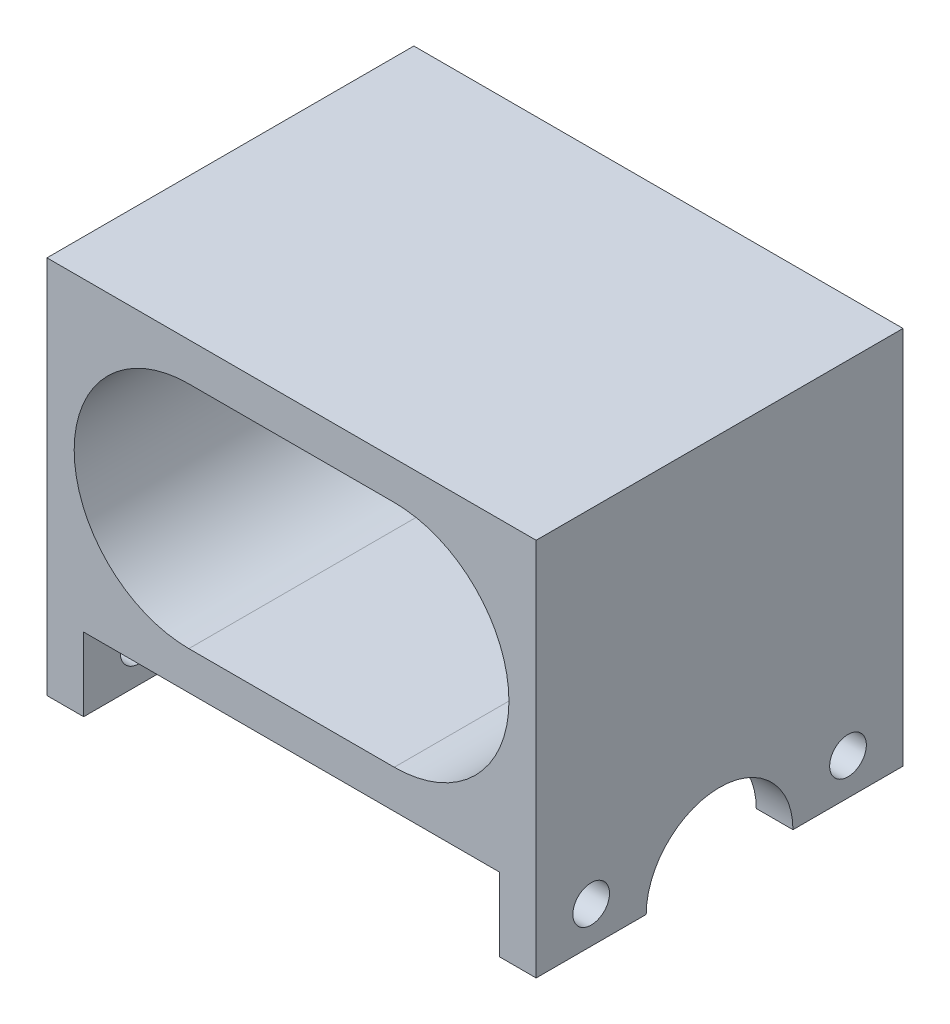
ISO-10303-21;
HEADER;
FILE_DESCRIPTION(('STEP AP214'),'2;1');
FILE_NAME('part.step','',(''),(''),'','','');
FILE_SCHEMA(('AUTOMOTIVE_DESIGN { 1 0 10303 214 1 1 1 1 }'));
ENDSEC;
DATA;
#1=APPLICATION_CONTEXT('core data for automotive mechanical design processes');
#2=APPLICATION_PROTOCOL_DEFINITION('international standard','automotive_design',2000,#1);
#3=PRODUCT_CONTEXT('',#1,'mechanical');
#4=PRODUCT('Part','Part','',(#3));
#5=PRODUCT_RELATED_PRODUCT_CATEGORY('part','',(#4));
#6=PRODUCT_DEFINITION_FORMATION('','',#4);
#7=PRODUCT_DEFINITION_CONTEXT('part definition',#1,'design');
#8=PRODUCT_DEFINITION('design','',#6,#7);
#9=PRODUCT_DEFINITION_SHAPE('','',#8);
#10=(LENGTH_UNIT() NAMED_UNIT(*) SI_UNIT(.MILLI.,.METRE.));
#11=(NAMED_UNIT(*) PLANE_ANGLE_UNIT() SI_UNIT($,.RADIAN.));
#12=(NAMED_UNIT(*) SI_UNIT($,.STERADIAN.) SOLID_ANGLE_UNIT());
#13=UNCERTAINTY_MEASURE_WITH_UNIT(LENGTH_MEASURE(1.E-05),#10,'distance_accuracy_value','');
#14=(GEOMETRIC_REPRESENTATION_CONTEXT(3) GLOBAL_UNCERTAINTY_ASSIGNED_CONTEXT((#13)) GLOBAL_UNIT_ASSIGNED_CONTEXT((#10,
#11,#12)) REPRESENTATION_CONTEXT('',''));
#15=CARTESIAN_POINT('',(0.,0.,0.));
#16=DIRECTION('',(0.,0.,1.));
#17=DIRECTION('',(1.,0.,0.));
#18=AXIS2_PLACEMENT_3D('',#15,#16,#17);
#19=CARTESIAN_POINT('',(-20.,-12.5,-15.));
#20=DIRECTION('',(0.,-1.,0.));
#21=DIRECTION('',(0.,0.,-1.));
#22=AXIS2_PLACEMENT_3D('',#19,#20,#21);
#23=PLANE('',#22);
#24=DIRECTION('',(0.,0.,1.));
#25=VECTOR('',#24,1.);
#26=CARTESIAN_POINT('',(-17.,-12.5,15.));
#27=LINE('',#26,#25);
#28=CARTESIAN_POINT('',(-17.,-12.5,0.));
#29=VERTEX_POINT('',#28);
#30=CARTESIAN_POINT('',(-17.,-12.5,15.));
#31=VERTEX_POINT('',#30);
#32=EDGE_CURVE('E172',#29,#31,#27,.T.);
#33=ORIENTED_EDGE('',*,*,#32,.F.);
#34=DIRECTION('',(0.,0.,-1.));
#35=VECTOR('',#34,1.);
#36=CARTESIAN_POINT('',(-17.,-12.5,-15.));
#37=LINE('',#36,#35);
#38=CARTESIAN_POINT('',(-17.,-12.5,-15.));
#39=VERTEX_POINT('',#38);
#40=EDGE_CURVE('E303',#29,#39,#37,.T.);
#41=ORIENTED_EDGE('',*,*,#40,.T.);
#42=DIRECTION('',(1.,0.,0.));
#43=VECTOR('',#42,1.);
#44=CARTESIAN_POINT('',(-20.,-12.5,-15.));
#45=LINE('',#44,#43);
#46=CARTESIAN_POINT('',(17.,-12.5,-15.));
#47=VERTEX_POINT('',#46);
#48=EDGE_CURVE('E288',#39,#47,#45,.T.);
#49=ORIENTED_EDGE('',*,*,#48,.T.);
#50=DIRECTION('',(0.,0.,-1.));
#51=VECTOR('',#50,1.);
#52=CARTESIAN_POINT('',(17.,-12.5,-15.));
#53=LINE('',#52,#51);
#54=CARTESIAN_POINT('',(17.,-12.5,0.));
#55=VERTEX_POINT('',#54);
#56=EDGE_CURVE('E331',#55,#47,#53,.T.);
#57=ORIENTED_EDGE('',*,*,#56,.F.);
#58=DIRECTION('',(0.,0.,1.));
#59=VECTOR('',#58,1.);
#60=CARTESIAN_POINT('',(17.,-12.5,15.));
#61=LINE('',#60,#59);
#62=CARTESIAN_POINT('',(17.,-12.5,15.));
#63=VERTEX_POINT('',#62);
#64=EDGE_CURVE('E220',#55,#63,#61,.T.);
#65=ORIENTED_EDGE('',*,*,#64,.T.);
#66=DIRECTION('',(1.,0.,0.));
#67=VECTOR('',#66,1.);
#68=CARTESIAN_POINT('',(-20.,-12.5,15.));
#69=LINE('',#68,#67);
#70=EDGE_CURVE('E258',#31,#63,#69,.T.);
#71=ORIENTED_EDGE('',*,*,#70,.F.);
#72=EDGE_LOOP('',(#33,#41,#49,#57,#65,#71));
#73=FACE_BOUND('',#72,.T.);
#74=ADVANCED_FACE('F33',(#73),#23,.T.);
#75=CARTESIAN_POINT('',(20.,-12.5,-15.));
#76=DIRECTION('',(1.,0.,0.));
#77=DIRECTION('',(0.,0.,-1.));
#78=AXIS2_PLACEMENT_3D('',#75,#76,#77);
#79=PLANE('',#78);
#80=DIRECTION('',(0.,0.,1.));
#81=VECTOR('',#80,1.);
#82=CARTESIAN_POINT('',(20.,12.5,-15.));
#83=LINE('',#82,#81);
#84=CARTESIAN_POINT('',(20.,12.5,-15.));
#85=VERTEX_POINT('',#84);
#86=CARTESIAN_POINT('',(20.,12.5,15.));
#87=VERTEX_POINT('',#86);
#88=EDGE_CURVE('E290',#85,#87,#83,.T.);
#89=ORIENTED_EDGE('',*,*,#88,.T.);
#90=DIRECTION('',(0.,1.,0.));
#91=VECTOR('',#90,1.);
#92=CARTESIAN_POINT('',(20.,-12.5,15.));
#93=LINE('',#92,#91);
#94=CARTESIAN_POINT('',(20.,-18.5,15.));
#95=VERTEX_POINT('',#94);
#96=EDGE_CURVE('E250',#95,#87,#93,.T.);
#97=ORIENTED_EDGE('',*,*,#96,.F.);
#98=DIRECTION('',(0.,0.,-1.));
#99=VECTOR('',#98,1.);
#100=CARTESIAN_POINT('',(20.,-18.5,15.));
#101=LINE('',#100,#99);
#102=CARTESIAN_POINT('',(20.,-18.5,6.));
#103=VERTEX_POINT('',#102);
#104=EDGE_CURVE('E230',#95,#103,#101,.T.);
#105=ORIENTED_EDGE('',*,*,#104,.T.);
#106=CARTESIAN_POINT('',(20.,-18.5,0.));
#107=DIRECTION('',(1.,0.,0.));
#108=DIRECTION('',(0.,0.,-1.));
#109=AXIS2_PLACEMENT_3D('',#106,#107,#108);
#110=CIRCLE('',#109,6.);
#111=CARTESIAN_POINT('',(20.,-12.5,0.));
#112=VERTEX_POINT('',#111);
#113=EDGE_CURVE('E42',#103,#112,#110,.F.);
#114=ORIENTED_EDGE('',*,*,#113,.T.);
#115=CARTESIAN_POINT('',(20.,-18.5,0.));
#116=DIRECTION('',(1.,0.,0.));
#117=DIRECTION('',(0.,0.,-1.));
#118=AXIS2_PLACEMENT_3D('',#115,#116,#117);
#119=CIRCLE('',#118,6.);
#120=CARTESIAN_POINT('',(20.,-18.5,-6.));
#121=VERTEX_POINT('',#120);
#122=EDGE_CURVE('E186',#112,#121,#119,.F.);
#123=ORIENTED_EDGE('',*,*,#122,.T.);
#124=DIRECTION('',(0.,0.,1.));
#125=VECTOR('',#124,1.);
#126=CARTESIAN_POINT('',(20.,-18.5,-15.));
#127=LINE('',#126,#125);
#128=CARTESIAN_POINT('',(20.,-18.5,-15.));
#129=VERTEX_POINT('',#128);
#130=EDGE_CURVE('E326',#129,#121,#127,.T.);
#131=ORIENTED_EDGE('',*,*,#130,.F.);
#132=DIRECTION('',(0.,1.,0.));
#133=VECTOR('',#132,1.);
#134=CARTESIAN_POINT('',(20.,-12.5,-15.));
#135=LINE('',#134,#133);
#136=EDGE_CURVE('E275',#129,#85,#135,.T.);
#137=ORIENTED_EDGE('',*,*,#136,.T.);
#138=EDGE_LOOP('',(#89,#97,#105,#114,#123,#131,#137));
#139=FACE_BOUND('',#138,.T.);
#140=CARTESIAN_POINT('',(20.,-15.5,10.5));
#141=DIRECTION('',(1.,0.,0.));
#142=DIRECTION('',(0.,0.,-1.));
#143=AXIS2_PLACEMENT_3D('',#140,#141,#142);
#144=CIRCLE('',#143,1.5);
#145=CARTESIAN_POINT('',(20.,-15.5,9.));
#146=VERTEX_POINT('',#145);
#147=EDGE_CURVE('E342',#146,#146,#144,.T.);
#148=ORIENTED_EDGE('',*,*,#147,.F.);
#149=EDGE_LOOP('',(#148));
#150=FACE_BOUND('',#149,.T.);
#151=CARTESIAN_POINT('',(20.,-15.5,-10.5));
#152=DIRECTION('',(-1.,0.,0.));
#153=DIRECTION('',(0.,0.,1.));
#154=AXIS2_PLACEMENT_3D('',#151,#152,#153);
#155=CIRCLE('',#154,1.5);
#156=CARTESIAN_POINT('',(20.,-15.5,-9.));
#157=VERTEX_POINT('',#156);
#158=EDGE_CURVE('E315',#157,#157,#155,.T.);
#159=ORIENTED_EDGE('',*,*,#158,.T.);
#160=EDGE_LOOP('',(#159));
#161=FACE_BOUND('',#160,.T.);
#162=ADVANCED_FACE('F350',(#139,#150,#161),#79,.T.);
#163=CARTESIAN_POINT('',(-20.,-12.5,-15.));
#164=DIRECTION('',(-1.,0.,0.));
#165=DIRECTION('',(0.,0.,1.));
#166=AXIS2_PLACEMENT_3D('',#163,#164,#165);
#167=PLANE('',#166);
#168=DIRECTION('',(0.,-1.,0.));
#169=VECTOR('',#168,1.);
#170=CARTESIAN_POINT('',(-20.,-12.5,-15.));
#171=LINE('',#170,#169);
#172=CARTESIAN_POINT('',(-20.,12.5,-15.));
#173=VERTEX_POINT('',#172);
#174=CARTESIAN_POINT('',(-20.,-18.5,-15.));
#175=VERTEX_POINT('',#174);
#176=EDGE_CURVE('E286',#173,#175,#171,.T.);
#177=ORIENTED_EDGE('',*,*,#176,.T.);
#178=DIRECTION('',(0.,0.,1.));
#179=VECTOR('',#178,1.);
#180=CARTESIAN_POINT('',(-20.,-18.5,-15.));
#181=LINE('',#180,#179);
#182=CARTESIAN_POINT('',(-20.,-18.5,-6.));
#183=VERTEX_POINT('',#182);
#184=EDGE_CURVE('E322',#175,#183,#181,.T.);
#185=ORIENTED_EDGE('',*,*,#184,.T.);
#186=CARTESIAN_POINT('',(-20.,-18.5,0.));
#187=DIRECTION('',(-1.,0.,0.));
#188=DIRECTION('',(0.,0.,1.));
#189=AXIS2_PLACEMENT_3D('',#186,#187,#188);
#190=CIRCLE('',#189,6.);
#191=CARTESIAN_POINT('',(-20.,-12.5,0.));
#192=VERTEX_POINT('',#191);
#193=EDGE_CURVE('E57',#183,#192,#190,.F.);
#194=ORIENTED_EDGE('',*,*,#193,.T.);
#195=CARTESIAN_POINT('',(-20.,-18.5,0.));
#196=DIRECTION('',(-1.,0.,0.));
#197=DIRECTION('',(0.,0.,1.));
#198=AXIS2_PLACEMENT_3D('',#195,#196,#197);
#199=CIRCLE('',#198,6.);
#200=CARTESIAN_POINT('',(-20.,-18.5,6.));
#201=VERTEX_POINT('',#200);
#202=EDGE_CURVE('E187',#192,#201,#199,.F.);
#203=ORIENTED_EDGE('',*,*,#202,.T.);
#204=DIRECTION('',(0.,0.,-1.));
#205=VECTOR('',#204,1.);
#206=CARTESIAN_POINT('',(-20.,-18.5,15.));
#207=LINE('',#206,#205);
#208=CARTESIAN_POINT('',(-20.,-18.5,15.));
#209=VERTEX_POINT('',#208);
#210=EDGE_CURVE('E178',#209,#201,#207,.T.);
#211=ORIENTED_EDGE('',*,*,#210,.F.);
#212=DIRECTION('',(0.,-1.,0.));
#213=VECTOR('',#212,1.);
#214=CARTESIAN_POINT('',(-20.,-12.5,15.));
#215=LINE('',#214,#213);
#216=CARTESIAN_POINT('',(-20.,12.5,15.));
#217=VERTEX_POINT('',#216);
#218=EDGE_CURVE('E256',#217,#209,#215,.T.);
#219=ORIENTED_EDGE('',*,*,#218,.F.);
#220=DIRECTION('',(0.,0.,1.));
#221=VECTOR('',#220,1.);
#222=CARTESIAN_POINT('',(-20.,12.5,-15.));
#223=LINE('',#222,#221);
#224=EDGE_CURVE('E291',#173,#217,#223,.T.);
#225=ORIENTED_EDGE('',*,*,#224,.F.);
#226=EDGE_LOOP('',(#177,#185,#194,#203,#211,#219,#225));
#227=FACE_BOUND('',#226,.T.);
#228=CARTESIAN_POINT('',(-20.,-15.5,-10.5));
#229=DIRECTION('',(-1.,0.,0.));
#230=DIRECTION('',(0.,0.,1.));
#231=AXIS2_PLACEMENT_3D('',#228,#229,#230);
#232=CIRCLE('',#231,1.5);
#233=CARTESIAN_POINT('',(-20.,-15.5,-9.));
#234=VERTEX_POINT('',#233);
#235=EDGE_CURVE('E615',#234,#234,#232,.T.);
#236=ORIENTED_EDGE('',*,*,#235,.F.);
#237=EDGE_LOOP('',(#236));
#238=FACE_BOUND('',#237,.T.);
#239=CARTESIAN_POINT('',(-20.,-15.5,10.5));
#240=DIRECTION('',(1.,0.,0.));
#241=DIRECTION('',(0.,0.,-1.));
#242=AXIS2_PLACEMENT_3D('',#239,#240,#241);
#243=CIRCLE('',#242,1.5);
#244=CARTESIAN_POINT('',(-20.,-15.5,9.));
#245=VERTEX_POINT('',#244);
#246=EDGE_CURVE('E197',#245,#245,#243,.T.);
#247=ORIENTED_EDGE('',*,*,#246,.T.);
#248=EDGE_LOOP('',(#247));
#249=FACE_BOUND('',#248,.T.);
#250=ADVANCED_FACE('F353',(#227,#238,#249),#167,.T.);
#251=CARTESIAN_POINT('',(-20.,12.5,-15.));
#252=DIRECTION('',(0.,1.,0.));
#253=DIRECTION('',(-1.,0.,0.));
#254=AXIS2_PLACEMENT_3D('',#251,#252,#253);
#255=PLANE('',#254);
#256=ORIENTED_EDGE('',*,*,#224,.T.);
#257=DIRECTION('',(-1.,0.,0.));
#258=VECTOR('',#257,1.);
#259=CARTESIAN_POINT('',(-20.,12.5,15.));
#260=LINE('',#259,#258);
#261=EDGE_CURVE('E253',#87,#217,#260,.T.);
#262=ORIENTED_EDGE('',*,*,#261,.F.);
#263=ORIENTED_EDGE('',*,*,#88,.F.);
#264=DIRECTION('',(-1.,0.,0.));
#265=VECTOR('',#264,1.);
#266=CARTESIAN_POINT('',(-20.,12.5,-15.));
#267=LINE('',#266,#265);
#268=EDGE_CURVE('E283',#85,#173,#267,.T.);
#269=ORIENTED_EDGE('',*,*,#268,.T.);
#270=EDGE_LOOP('',(#256,#262,#263,#269));
#271=FACE_BOUND('',#270,.T.);
#272=ADVANCED_FACE('F382',(#271),#255,.T.);
#273=CARTESIAN_POINT('',(0.,0.,-15.));
#274=DIRECTION('',(0.,0.,-1.));
#275=DIRECTION('',(-1.,0.,0.));
#276=AXIS2_PLACEMENT_3D('',#273,#274,#275);
#277=PLANE('',#276);
#278=CARTESIAN_POINT('',(-8.4,0.,-15.));
#279=DIRECTION('',(0.,0.,1.));
#280=DIRECTION('',(1.,0.,0.));
#281=AXIS2_PLACEMENT_3D('',#278,#279,#280);
#282=CIRCLE('',#281,9.375);
#283=CARTESIAN_POINT('',(-8.4,9.37500000000001,-15.));
#284=VERTEX_POINT('',#283);
#285=CARTESIAN_POINT('',(-8.4,-9.375,-15.));
#286=VERTEX_POINT('',#285);
#287=EDGE_CURVE('E260',#284,#286,#282,.T.);
#288=ORIENTED_EDGE('',*,*,#287,.T.);
#289=DIRECTION('',(1.,0.,0.));
#290=VECTOR('',#289,1.);
#291=CARTESIAN_POINT('',(-8.4,-9.375,-15.));
#292=LINE('',#291,#290);
#293=CARTESIAN_POINT('',(8.39999999999999,-9.375,-15.));
#294=VERTEX_POINT('',#293);
#295=EDGE_CURVE('E263',#286,#294,#292,.T.);
#296=ORIENTED_EDGE('',*,*,#295,.T.);
#297=CARTESIAN_POINT('',(8.39999999999999,0.,-15.));
#298=DIRECTION('',(0.,0.,1.));
#299=DIRECTION('',(1.,0.,0.));
#300=AXIS2_PLACEMENT_3D('',#297,#298,#299);
#301=CIRCLE('',#300,9.375);
#302=CARTESIAN_POINT('',(8.39999999999999,9.37500000000001,-15.));
#303=VERTEX_POINT('',#302);
#304=EDGE_CURVE('E266',#294,#303,#301,.T.);
#305=ORIENTED_EDGE('',*,*,#304,.T.);
#306=DIRECTION('',(-1.,0.,0.));
#307=VECTOR('',#306,1.);
#308=CARTESIAN_POINT('',(-8.4,9.37500000000001,-15.));
#309=LINE('',#308,#307);
#310=EDGE_CURVE('E269',#303,#284,#309,.T.);
#311=ORIENTED_EDGE('',*,*,#310,.T.);
#312=EDGE_LOOP('',(#288,#296,#305,#311));
#313=FACE_BOUND('',#312,.T.);
#314=ORIENTED_EDGE('',*,*,#136,.F.);
#315=DIRECTION('',(1.,0.,0.));
#316=VECTOR('',#315,1.);
#317=CARTESIAN_POINT('',(17.,-18.5,-15.));
#318=LINE('',#317,#316);
#319=CARTESIAN_POINT('',(17.,-18.5,-15.));
#320=VERTEX_POINT('',#319);
#321=EDGE_CURVE('E339',#320,#129,#318,.T.);
#322=ORIENTED_EDGE('',*,*,#321,.F.);
#323=DIRECTION('',(0.,-1.,0.));
#324=VECTOR('',#323,1.);
#325=CARTESIAN_POINT('',(17.,-12.5,-15.));
#326=LINE('',#325,#324);
#327=EDGE_CURVE('E328',#47,#320,#326,.T.);
#328=ORIENTED_EDGE('',*,*,#327,.F.);
#329=ORIENTED_EDGE('',*,*,#48,.F.);
#330=DIRECTION('',(0.,-1.,0.));
#331=VECTOR('',#330,1.);
#332=CARTESIAN_POINT('',(-17.,-12.5,-15.));
#333=LINE('',#332,#331);
#334=CARTESIAN_POINT('',(-17.,-18.5,-15.));
#335=VERTEX_POINT('',#334);
#336=EDGE_CURVE('E312',#39,#335,#333,.T.);
#337=ORIENTED_EDGE('',*,*,#336,.T.);
#338=DIRECTION('',(-1.,0.,0.));
#339=VECTOR('',#338,1.);
#340=CARTESIAN_POINT('',(-17.,-18.5,-15.));
#341=LINE('',#340,#339);
#342=EDGE_CURVE('E311',#335,#175,#341,.T.);
#343=ORIENTED_EDGE('',*,*,#342,.T.);
#344=ORIENTED_EDGE('',*,*,#176,.F.);
#345=ORIENTED_EDGE('',*,*,#268,.F.);
#346=EDGE_LOOP('',(#314,#322,#328,#329,#337,#343,#344,#345));
#347=FACE_BOUND('',#346,.T.);
#348=ADVANCED_FACE('F378',(#313,#347),#277,.T.);
#349=CARTESIAN_POINT('',(-8.4,0.,-15.));
#350=DIRECTION('',(0.,0.,1.));
#351=DIRECTION('',(1.,0.,0.));
#352=AXIS2_PLACEMENT_3D('',#349,#350,#351);
#353=CYLINDRICAL_SURFACE('',#352,9.375);
#354=DIRECTION('',(0.,0.,1.));
#355=VECTOR('',#354,1.);
#356=CARTESIAN_POINT('',(-8.4,9.37500000000001,-15.));
#357=LINE('',#356,#355);
#358=CARTESIAN_POINT('',(-8.4,9.37500000000001,15.));
#359=VERTEX_POINT('',#358);
#360=EDGE_CURVE('E273',#284,#359,#357,.T.);
#361=ORIENTED_EDGE('',*,*,#360,.T.);
#362=CARTESIAN_POINT('',(-8.4,0.,15.));
#363=DIRECTION('',(0.,0.,1.));
#364=DIRECTION('',(1.,0.,0.));
#365=AXIS2_PLACEMENT_3D('',#362,#363,#364);
#366=CIRCLE('',#365,9.375);
#367=CARTESIAN_POINT('',(-8.4,-9.375,15.));
#368=VERTEX_POINT('',#367);
#369=EDGE_CURVE('E237',#359,#368,#366,.T.);
#370=ORIENTED_EDGE('',*,*,#369,.T.);
#371=DIRECTION('',(0.,0.,1.));
#372=VECTOR('',#371,1.);
#373=CARTESIAN_POINT('',(-8.4,-9.375,-15.));
#374=LINE('',#373,#372);
#375=EDGE_CURVE('E272',#286,#368,#374,.T.);
#376=ORIENTED_EDGE('',*,*,#375,.F.);
#377=ORIENTED_EDGE('',*,*,#287,.F.);
#378=EDGE_LOOP('',(#361,#370,#376,#377));
#379=FACE_BOUND('',#378,.T.);
#380=ADVANCED_FACE('F526',(#379),#353,.F.);
#381=CARTESIAN_POINT('',(-8.4,9.37500000000001,-15.));
#382=DIRECTION('',(0.,1.,0.));
#383=DIRECTION('',(-1.,0.,0.));
#384=AXIS2_PLACEMENT_3D('',#381,#382,#383);
#385=PLANE('',#384);
#386=DIRECTION('',(0.,0.,1.));
#387=VECTOR('',#386,1.);
#388=CARTESIAN_POINT('',(8.39999999999999,9.37500000000001,-15.));
#389=LINE('',#388,#387);
#390=CARTESIAN_POINT('',(8.39999999999999,9.37500000000001,15.));
#391=VERTEX_POINT('',#390);
#392=EDGE_CURVE('E276',#303,#391,#389,.T.);
#393=ORIENTED_EDGE('',*,*,#392,.T.);
#394=DIRECTION('',(-1.,0.,0.));
#395=VECTOR('',#394,1.);
#396=CARTESIAN_POINT('',(-8.4,9.37500000000001,15.));
#397=LINE('',#396,#395);
#398=EDGE_CURVE('E247',#391,#359,#397,.T.);
#399=ORIENTED_EDGE('',*,*,#398,.T.);
#400=ORIENTED_EDGE('',*,*,#360,.F.);
#401=ORIENTED_EDGE('',*,*,#310,.F.);
#402=EDGE_LOOP('',(#393,#399,#400,#401));
#403=FACE_BOUND('',#402,.T.);
#404=ADVANCED_FACE('F534',(#403),#385,.F.);
#405=CARTESIAN_POINT('',(8.39999999999999,0.,-15.));
#406=DIRECTION('',(0.,0.,1.));
#407=DIRECTION('',(1.,0.,0.));
#408=AXIS2_PLACEMENT_3D('',#405,#406,#407);
#409=CYLINDRICAL_SURFACE('',#408,9.375);
#410=DIRECTION('',(0.,0.,1.));
#411=VECTOR('',#410,1.);
#412=CARTESIAN_POINT('',(8.39999999999999,-9.375,-15.));
#413=LINE('',#412,#411);
#414=CARTESIAN_POINT('',(8.39999999999999,-9.375,15.));
#415=VERTEX_POINT('',#414);
#416=EDGE_CURVE('E278',#294,#415,#413,.T.);
#417=ORIENTED_EDGE('',*,*,#416,.T.);
#418=CARTESIAN_POINT('',(8.39999999999999,0.,15.));
#419=DIRECTION('',(0.,0.,1.));
#420=DIRECTION('',(1.,0.,0.));
#421=AXIS2_PLACEMENT_3D('',#418,#419,#420);
#422=CIRCLE('',#421,9.375);
#423=EDGE_CURVE('E244',#415,#391,#422,.T.);
#424=ORIENTED_EDGE('',*,*,#423,.T.);
#425=ORIENTED_EDGE('',*,*,#392,.F.);
#426=ORIENTED_EDGE('',*,*,#304,.F.);
#427=EDGE_LOOP('',(#417,#424,#425,#426));
#428=FACE_BOUND('',#427,.T.);
#429=ADVANCED_FACE('F542',(#428),#409,.F.);
#430=CARTESIAN_POINT('',(-8.4,-9.375,-15.));
#431=DIRECTION('',(0.,-1.,0.));
#432=DIRECTION('',(1.,0.,0.));
#433=AXIS2_PLACEMENT_3D('',#430,#431,#432);
#434=PLANE('',#433);
#435=ORIENTED_EDGE('',*,*,#375,.T.);
#436=DIRECTION('',(1.,0.,0.));
#437=VECTOR('',#436,1.);
#438=CARTESIAN_POINT('',(-8.4,-9.375,15.));
#439=LINE('',#438,#437);
#440=EDGE_CURVE('E241',#368,#415,#439,.T.);
#441=ORIENTED_EDGE('',*,*,#440,.T.);
#442=ORIENTED_EDGE('',*,*,#416,.F.);
#443=ORIENTED_EDGE('',*,*,#295,.F.);
#444=EDGE_LOOP('',(#435,#441,#442,#443));
#445=FACE_BOUND('',#444,.T.);
#446=ADVANCED_FACE('F551',(#445),#434,.F.);
#447=CARTESIAN_POINT('',(0.,0.,15.));
#448=DIRECTION('',(0.,0.,-1.));
#449=DIRECTION('',(-1.,0.,0.));
#450=AXIS2_PLACEMENT_3D('',#447,#448,#449);
#451=PLANE('',#450);
#452=ORIENTED_EDGE('',*,*,#96,.T.);
#453=ORIENTED_EDGE('',*,*,#261,.T.);
#454=ORIENTED_EDGE('',*,*,#218,.T.);
#455=DIRECTION('',(-1.,0.,0.));
#456=VECTOR('',#455,1.);
#457=CARTESIAN_POINT('',(-17.,-18.5,15.));
#458=LINE('',#457,#456);
#459=CARTESIAN_POINT('',(-17.,-18.5,15.));
#460=VERTEX_POINT('',#459);
#461=EDGE_CURVE('E180',#460,#209,#458,.T.);
#462=ORIENTED_EDGE('',*,*,#461,.F.);
#463=DIRECTION('',(0.,-1.,0.));
#464=VECTOR('',#463,1.);
#465=CARTESIAN_POINT('',(-17.,-12.5,15.));
#466=LINE('',#465,#464);
#467=EDGE_CURVE('E167',#31,#460,#466,.T.);
#468=ORIENTED_EDGE('',*,*,#467,.F.);
#469=ORIENTED_EDGE('',*,*,#70,.T.);
#470=DIRECTION('',(0.,-1.,0.));
#471=VECTOR('',#470,1.);
#472=CARTESIAN_POINT('',(17.,-12.5,15.));
#473=LINE('',#472,#471);
#474=CARTESIAN_POINT('',(17.,-18.5,15.));
#475=VERTEX_POINT('',#474);
#476=EDGE_CURVE('E227',#63,#475,#473,.T.);
#477=ORIENTED_EDGE('',*,*,#476,.T.);
#478=DIRECTION('',(1.,0.,0.));
#479=VECTOR('',#478,1.);
#480=CARTESIAN_POINT('',(17.,-18.5,15.));
#481=LINE('',#480,#479);
#482=EDGE_CURVE('E226',#475,#95,#481,.T.);
#483=ORIENTED_EDGE('',*,*,#482,.T.);
#484=EDGE_LOOP('',(#452,#453,#454,#462,#468,#469,#477,#483));
#485=FACE_BOUND('',#484,.T.);
#486=ORIENTED_EDGE('',*,*,#369,.F.);
#487=ORIENTED_EDGE('',*,*,#398,.F.);
#488=ORIENTED_EDGE('',*,*,#423,.F.);
#489=ORIENTED_EDGE('',*,*,#440,.F.);
#490=EDGE_LOOP('',(#486,#487,#488,#489));
#491=FACE_BOUND('',#490,.T.);
#492=ADVANCED_FACE('F480',(#485,#491),#451,.F.);
#493=CARTESIAN_POINT('',(17.,-18.5,15.));
#494=DIRECTION('',(0.,-1.,0.));
#495=DIRECTION('',(0.,0.,-1.));
#496=AXIS2_PLACEMENT_3D('',#493,#494,#495);
#497=PLANE('',#496);
#498=ORIENTED_EDGE('',*,*,#104,.F.);
#499=ORIENTED_EDGE('',*,*,#482,.F.);
#500=DIRECTION('',(0.,0.,-1.));
#501=VECTOR('',#500,1.);
#502=CARTESIAN_POINT('',(17.,-18.5,15.));
#503=LINE('',#502,#501);
#504=CARTESIAN_POINT('',(17.,-18.5,6.));
#505=VERTEX_POINT('',#504);
#506=EDGE_CURVE('E217',#475,#505,#503,.T.);
#507=ORIENTED_EDGE('',*,*,#506,.T.);
#508=DIRECTION('',(1.,0.,0.));
#509=VECTOR('',#508,1.);
#510=CARTESIAN_POINT('',(17.,-18.5,6.));
#511=LINE('',#510,#509);
#512=EDGE_CURVE('E211',#505,#103,#511,.T.);
#513=ORIENTED_EDGE('',*,*,#512,.T.);
#514=EDGE_LOOP('',(#498,#499,#507,#513));
#515=FACE_BOUND('',#514,.T.);
#516=ADVANCED_FACE('F224',(#515),#497,.T.);
#517=CARTESIAN_POINT('',(17.,0.,0.));
#518=DIRECTION('',(1.,0.,0.));
#519=DIRECTION('',(0.,0.,-1.));
#520=AXIS2_PLACEMENT_3D('',#517,#518,#519);
#521=PLANE('',#520);
#522=CARTESIAN_POINT('',(17.,-15.5,10.5));
#523=DIRECTION('',(1.,0.,0.));
#524=DIRECTION('',(0.,0.,-1.));
#525=AXIS2_PLACEMENT_3D('',#522,#523,#524);
#526=CIRCLE('',#525,1.5);
#527=CARTESIAN_POINT('',(17.,-15.5,9.));
#528=VERTEX_POINT('',#527);
#529=EDGE_CURVE('E235',#528,#528,#526,.T.);
#530=ORIENTED_EDGE('',*,*,#529,.T.);
#531=EDGE_LOOP('',(#530));
#532=FACE_BOUND('',#531,.T.);
#533=ORIENTED_EDGE('',*,*,#476,.F.);
#534=ORIENTED_EDGE('',*,*,#64,.F.);
#535=CARTESIAN_POINT('',(17.,-18.5,0.));
#536=DIRECTION('',(1.,0.,0.));
#537=DIRECTION('',(0.,0.,-1.));
#538=AXIS2_PLACEMENT_3D('',#535,#536,#537);
#539=CIRCLE('',#538,6.);
#540=EDGE_CURVE('E11',#55,#505,#539,.T.);
#541=ORIENTED_EDGE('',*,*,#540,.T.);
#542=ORIENTED_EDGE('',*,*,#506,.F.);
#543=EDGE_LOOP('',(#533,#534,#541,#542));
#544=FACE_BOUND('',#543,.T.);
#545=ADVANCED_FACE('F216',(#532,#544),#521,.F.);
#546=CARTESIAN_POINT('',(17.,-15.5,10.5));
#547=DIRECTION('',(1.,0.,0.));
#548=DIRECTION('',(0.,0.,-1.));
#549=AXIS2_PLACEMENT_3D('',#546,#547,#548);
#550=CYLINDRICAL_SURFACE('',#549,1.5);
#551=ORIENTED_EDGE('',*,*,#529,.F.);
#552=EDGE_LOOP('',(#551));
#553=FACE_BOUND('',#552,.T.);
#554=ORIENTED_EDGE('',*,*,#147,.T.);
#555=EDGE_LOOP('',(#554));
#556=FACE_BOUND('',#555,.T.);
#557=ADVANCED_FACE('F348',(#553,#556),#550,.F.);
#558=CARTESIAN_POINT('',(17.,0.,0.));
#559=DIRECTION('',(1.,0.,0.));
#560=DIRECTION('',(0.,0.,1.));
#561=AXIS2_PLACEMENT_3D('',#558,#559,#560);
#562=PLANE('',#561);
#563=ORIENTED_EDGE('',*,*,#327,.T.);
#564=DIRECTION('',(0.,0.,1.));
#565=VECTOR('',#564,1.);
#566=CARTESIAN_POINT('',(17.,-18.5,-15.));
#567=LINE('',#566,#565);
#568=CARTESIAN_POINT('',(17.,-18.5,-6.));
#569=VERTEX_POINT('',#568);
#570=EDGE_CURVE('E334',#320,#569,#567,.T.);
#571=ORIENTED_EDGE('',*,*,#570,.T.);
#572=CARTESIAN_POINT('',(17.,-18.5,0.));
#573=DIRECTION('',(1.,0.,0.));
#574=DIRECTION('',(0.,0.,-1.));
#575=AXIS2_PLACEMENT_3D('',#572,#573,#574);
#576=CIRCLE('',#575,6.);
#577=EDGE_CURVE('E189',#569,#55,#576,.T.);
#578=ORIENTED_EDGE('',*,*,#577,.T.);
#579=ORIENTED_EDGE('',*,*,#56,.T.);
#580=EDGE_LOOP('',(#563,#571,#578,#579));
#581=FACE_BOUND('',#580,.T.);
#582=CARTESIAN_POINT('',(17.,-15.5,-10.5));
#583=DIRECTION('',(-1.,0.,0.));
#584=DIRECTION('',(0.,0.,1.));
#585=AXIS2_PLACEMENT_3D('',#582,#583,#584);
#586=CIRCLE('',#585,1.5);
#587=CARTESIAN_POINT('',(17.,-15.5,-9.));
#588=VERTEX_POINT('',#587);
#589=EDGE_CURVE('E318',#588,#588,#586,.T.);
#590=ORIENTED_EDGE('',*,*,#589,.F.);
#591=EDGE_LOOP('',(#590));
#592=FACE_BOUND('',#591,.T.);
#593=ADVANCED_FACE('F367',(#581,#592),#562,.F.);
#594=CARTESIAN_POINT('',(17.,-18.5,-15.));
#595=DIRECTION('',(0.,1.,0.));
#596=DIRECTION('',(0.,0.,1.));
#597=AXIS2_PLACEMENT_3D('',#594,#595,#596);
#598=PLANE('',#597);
#599=ORIENTED_EDGE('',*,*,#130,.T.);
#600=DIRECTION('',(1.,0.,0.));
#601=VECTOR('',#600,1.);
#602=CARTESIAN_POINT('',(17.,-18.5,-6.));
#603=LINE('',#602,#601);
#604=EDGE_CURVE('E336',#569,#121,#603,.T.);
#605=ORIENTED_EDGE('',*,*,#604,.F.);
#606=ORIENTED_EDGE('',*,*,#570,.F.);
#607=ORIENTED_EDGE('',*,*,#321,.T.);
#608=EDGE_LOOP('',(#599,#605,#606,#607));
#609=FACE_BOUND('',#608,.T.);
#610=ADVANCED_FACE('F359',(#609),#598,.F.);
#611=CARTESIAN_POINT('',(17.,-15.5,-10.5));
#612=DIRECTION('',(1.,0.,0.));
#613=DIRECTION('',(0.,0.,-1.));
#614=AXIS2_PLACEMENT_3D('',#611,#612,#613);
#615=CYLINDRICAL_SURFACE('',#614,1.5);
#616=ORIENTED_EDGE('',*,*,#589,.T.);
#617=EDGE_LOOP('',(#616));
#618=FACE_BOUND('',#617,.T.);
#619=ORIENTED_EDGE('',*,*,#158,.F.);
#620=EDGE_LOOP('',(#619));
#621=FACE_BOUND('',#620,.T.);
#622=ADVANCED_FACE('F357',(#618,#621),#615,.F.);
#623=CARTESIAN_POINT('',(-17.,-18.5,-15.));
#624=DIRECTION('',(0.,-1.,0.));
#625=DIRECTION('',(0.,0.,-1.));
#626=AXIS2_PLACEMENT_3D('',#623,#624,#625);
#627=PLANE('',#626);
#628=ORIENTED_EDGE('',*,*,#184,.F.);
#629=ORIENTED_EDGE('',*,*,#342,.F.);
#630=DIRECTION('',(0.,0.,1.));
#631=VECTOR('',#630,1.);
#632=CARTESIAN_POINT('',(-17.,-18.5,-15.));
#633=LINE('',#632,#631);
#634=CARTESIAN_POINT('',(-17.,-18.5,-6.));
#635=VERTEX_POINT('',#634);
#636=EDGE_CURVE('E300',#335,#635,#633,.T.);
#637=ORIENTED_EDGE('',*,*,#636,.T.);
#638=DIRECTION('',(-1.,0.,0.));
#639=VECTOR('',#638,1.);
#640=CARTESIAN_POINT('',(-17.,-18.5,-6.));
#641=LINE('',#640,#639);
#642=EDGE_CURVE('E309',#635,#183,#641,.T.);
#643=ORIENTED_EDGE('',*,*,#642,.T.);
#644=EDGE_LOOP('',(#628,#629,#637,#643));
#645=FACE_BOUND('',#644,.T.);
#646=ADVANCED_FACE('F308',(#645),#627,.T.);
#647=CARTESIAN_POINT('',(-17.,0.,0.));
#648=DIRECTION('',(-1.,0.,0.));
#649=DIRECTION('',(0.,0.,1.));
#650=AXIS2_PLACEMENT_3D('',#647,#648,#649);
#651=PLANE('',#650);
#652=CARTESIAN_POINT('',(-17.,-15.5,-10.5));
#653=DIRECTION('',(-1.,0.,0.));
#654=DIRECTION('',(0.,0.,1.));
#655=AXIS2_PLACEMENT_3D('',#652,#653,#654);
#656=CIRCLE('',#655,1.5);
#657=CARTESIAN_POINT('',(-17.,-15.5,-9.));
#658=VERTEX_POINT('',#657);
#659=EDGE_CURVE('E613',#658,#658,#656,.T.);
#660=ORIENTED_EDGE('',*,*,#659,.T.);
#661=EDGE_LOOP('',(#660));
#662=FACE_BOUND('',#661,.T.);
#663=ORIENTED_EDGE('',*,*,#336,.F.);
#664=ORIENTED_EDGE('',*,*,#40,.F.);
#665=CARTESIAN_POINT('',(-17.,-18.5,0.));
#666=DIRECTION('',(-1.,0.,0.));
#667=DIRECTION('',(0.,0.,1.));
#668=AXIS2_PLACEMENT_3D('',#665,#666,#667);
#669=CIRCLE('',#668,6.);
#670=EDGE_CURVE('E191',#29,#635,#669,.T.);
#671=ORIENTED_EDGE('',*,*,#670,.T.);
#672=ORIENTED_EDGE('',*,*,#636,.F.);
#673=EDGE_LOOP('',(#663,#664,#671,#672));
#674=FACE_BOUND('',#673,.T.);
#675=ADVANCED_FACE('F299',(#662,#674),#651,.F.);
#676=CARTESIAN_POINT('',(-17.,-15.5,-10.5));
#677=DIRECTION('',(-1.,0.,0.));
#678=DIRECTION('',(0.,0.,1.));
#679=AXIS2_PLACEMENT_3D('',#676,#677,#678);
#680=CYLINDRICAL_SURFACE('',#679,1.5);
#681=ORIENTED_EDGE('',*,*,#659,.F.);
#682=EDGE_LOOP('',(#681));
#683=FACE_BOUND('',#682,.T.);
#684=ORIENTED_EDGE('',*,*,#235,.T.);
#685=EDGE_LOOP('',(#684));
#686=FACE_BOUND('',#685,.T.);
#687=ADVANCED_FACE('F424',(#683,#686),#680,.F.);
#688=CARTESIAN_POINT('',(-17.,0.,0.));
#689=DIRECTION('',(-1.,0.,0.));
#690=DIRECTION('',(0.,0.,-1.));
#691=AXIS2_PLACEMENT_3D('',#688,#689,#690);
#692=PLANE('',#691);
#693=ORIENTED_EDGE('',*,*,#467,.T.);
#694=DIRECTION('',(0.,0.,-1.));
#695=VECTOR('',#694,1.);
#696=CARTESIAN_POINT('',(-17.,-18.5,15.));
#697=LINE('',#696,#695);
#698=CARTESIAN_POINT('',(-17.,-18.5,6.));
#699=VERTEX_POINT('',#698);
#700=EDGE_CURVE('E159',#460,#699,#697,.T.);
#701=ORIENTED_EDGE('',*,*,#700,.T.);
#702=CARTESIAN_POINT('',(-17.,-18.5,0.));
#703=DIRECTION('',(-1.,0.,0.));
#704=DIRECTION('',(0.,0.,1.));
#705=AXIS2_PLACEMENT_3D('',#702,#703,#704);
#706=CIRCLE('',#705,6.);
#707=EDGE_CURVE('E165',#699,#29,#706,.T.);
#708=ORIENTED_EDGE('',*,*,#707,.T.);
#709=ORIENTED_EDGE('',*,*,#32,.T.);
#710=EDGE_LOOP('',(#693,#701,#708,#709));
#711=FACE_BOUND('',#710,.T.);
#712=CARTESIAN_POINT('',(-17.,-15.5,10.5));
#713=DIRECTION('',(1.,0.,0.));
#714=DIRECTION('',(0.,0.,-1.));
#715=AXIS2_PLACEMENT_3D('',#712,#713,#714);
#716=CIRCLE('',#715,1.5);
#717=CARTESIAN_POINT('',(-17.,-15.5,9.));
#718=VERTEX_POINT('',#717);
#719=EDGE_CURVE('E200',#718,#718,#716,.T.);
#720=ORIENTED_EDGE('',*,*,#719,.F.);
#721=EDGE_LOOP('',(#720));
#722=FACE_BOUND('',#721,.T.);
#723=ADVANCED_FACE('F161',(#711,#722),#692,.F.);
#724=CARTESIAN_POINT('',(-17.,-18.5,15.));
#725=DIRECTION('',(0.,1.,0.));
#726=DIRECTION('',(0.,0.,1.));
#727=AXIS2_PLACEMENT_3D('',#724,#725,#726);
#728=PLANE('',#727);
#729=ORIENTED_EDGE('',*,*,#210,.T.);
#730=DIRECTION('',(-1.,0.,0.));
#731=VECTOR('',#730,1.);
#732=CARTESIAN_POINT('',(-17.,-18.5,6.));
#733=LINE('',#732,#731);
#734=EDGE_CURVE('E171',#699,#201,#733,.T.);
#735=ORIENTED_EDGE('',*,*,#734,.F.);
#736=ORIENTED_EDGE('',*,*,#700,.F.);
#737=ORIENTED_EDGE('',*,*,#461,.T.);
#738=EDGE_LOOP('',(#729,#735,#736,#737));
#739=FACE_BOUND('',#738,.T.);
#740=ADVANCED_FACE('F176',(#739),#728,.F.);
#741=CARTESIAN_POINT('',(-17.,-15.5,10.5));
#742=DIRECTION('',(-1.,0.,0.));
#743=DIRECTION('',(0.,0.,1.));
#744=AXIS2_PLACEMENT_3D('',#741,#742,#743);
#745=CYLINDRICAL_SURFACE('',#744,1.5);
#746=ORIENTED_EDGE('',*,*,#719,.T.);
#747=EDGE_LOOP('',(#746));
#748=FACE_BOUND('',#747,.T.);
#749=ORIENTED_EDGE('',*,*,#246,.F.);
#750=EDGE_LOOP('',(#749));
#751=FACE_BOUND('',#750,.T.);
#752=ADVANCED_FACE('F389',(#748,#751),#745,.F.);
#753=CARTESIAN_POINT('',(-20.,-18.5,0.));
#754=DIRECTION('',(-1.,0.,0.));
#755=DIRECTION('',(0.,0.,1.));
#756=AXIS2_PLACEMENT_3D('',#753,#754,#755);
#757=CYLINDRICAL_SURFACE('',#756,6.);
#758=DIRECTION('',(-1.,0.,0.));
#759=VECTOR('',#758,1.);
#760=CARTESIAN_POINT('',(-20.,-12.5,0.));
#761=LINE('',#760,#759);
#762=EDGE_CURVE('E184',#29,#192,#761,.T.);
#763=ORIENTED_EDGE('',*,*,#762,.F.);
#764=ORIENTED_EDGE('',*,*,#707,.F.);
#765=ORIENTED_EDGE('',*,*,#734,.T.);
#766=ORIENTED_EDGE('',*,*,#202,.F.);
#767=EDGE_LOOP('',(#763,#764,#765,#766));
#768=FACE_BOUND('',#767,.T.);
#769=ADVANCED_FACE('F182',(#768),#757,.F.);
#770=CARTESIAN_POINT('',(-17.,-18.5,0.));
#771=DIRECTION('',(1.,0.,0.));
#772=DIRECTION('',(0.,0.,-1.));
#773=AXIS2_PLACEMENT_3D('',#770,#771,#772);
#774=CYLINDRICAL_SURFACE('',#773,6.);
#775=ORIENTED_EDGE('',*,*,#670,.F.);
#776=ORIENTED_EDGE('',*,*,#762,.T.);
#777=ORIENTED_EDGE('',*,*,#193,.F.);
#778=ORIENTED_EDGE('',*,*,#642,.F.);
#779=EDGE_LOOP('',(#775,#776,#777,#778));
#780=FACE_BOUND('',#779,.T.);
#781=ADVANCED_FACE('F314',(#780),#774,.F.);
#782=CARTESIAN_POINT('',(17.,-18.5,0.));
#783=DIRECTION('',(-1.,0.,0.));
#784=DIRECTION('',(0.,0.,1.));
#785=AXIS2_PLACEMENT_3D('',#782,#783,#784);
#786=CYLINDRICAL_SURFACE('',#785,6.);
#787=ORIENTED_EDGE('',*,*,#512,.F.);
#788=ORIENTED_EDGE('',*,*,#540,.F.);
#789=DIRECTION('',(1.,0.,0.));
#790=VECTOR('',#789,1.);
#791=CARTESIAN_POINT('',(17.,-12.5,0.));
#792=LINE('',#791,#790);
#793=EDGE_CURVE('E37',#112,#55,#792,.F.);
#794=ORIENTED_EDGE('',*,*,#793,.F.);
#795=ORIENTED_EDGE('',*,*,#113,.F.);
#796=EDGE_LOOP('',(#787,#788,#794,#795));
#797=FACE_BOUND('',#796,.T.);
#798=ADVANCED_FACE('F35',(#797),#786,.F.);
#799=CARTESIAN_POINT('',(-20.,-18.5,0.));
#800=DIRECTION('',(1.,0.,0.));
#801=DIRECTION('',(0.,0.,-1.));
#802=AXIS2_PLACEMENT_3D('',#799,#800,#801);
#803=CYLINDRICAL_SURFACE('',#802,6.);
#804=ORIENTED_EDGE('',*,*,#577,.F.);
#805=ORIENTED_EDGE('',*,*,#604,.T.);
#806=ORIENTED_EDGE('',*,*,#122,.F.);
#807=ORIENTED_EDGE('',*,*,#793,.T.);
#808=EDGE_LOOP('',(#804,#805,#806,#807));
#809=FACE_BOUND('',#808,.T.);
#810=ADVANCED_FACE('F205',(#809),#803,.F.);
#811=CLOSED_SHELL('',(#74,#162,#250,#272,#348,#380,#404,#429,#446,#492,#516,#545,#557,#593,#610,
#622,#646,#675,#687,#723,#740,#752,#769,#781,#798,#810));
#812=MANIFOLD_SOLID_BREP('B2',#811);
#813=ADVANCED_BREP_SHAPE_REPRESENTATION('',(#18,#812),#14);
#814=SHAPE_DEFINITION_REPRESENTATION(#9,#813);
ENDSEC;
END-ISO-10303-21;
